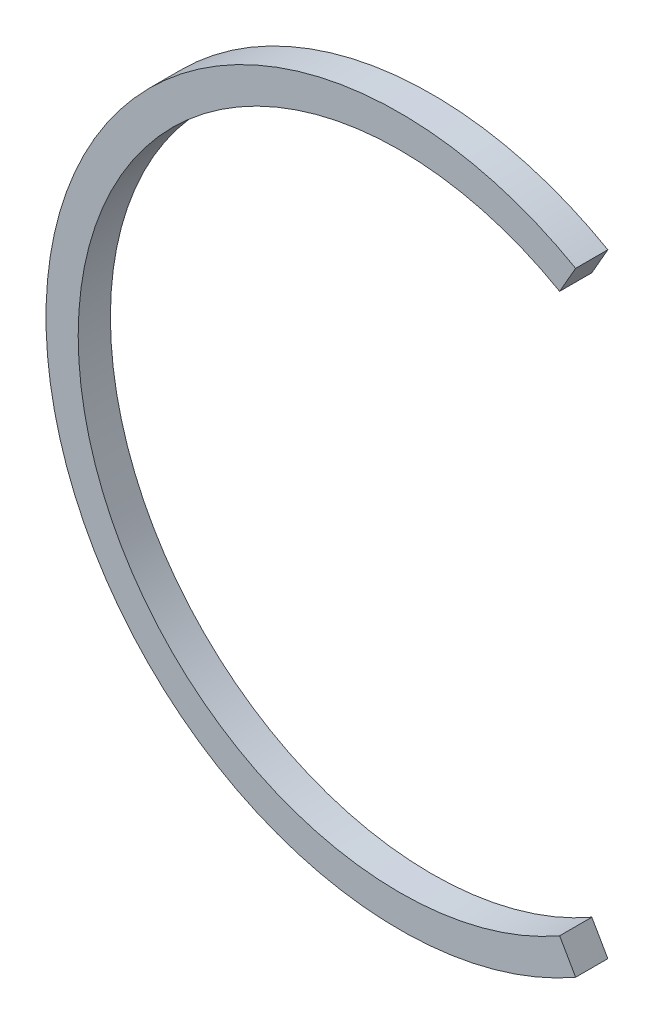
ISO-10303-21;
HEADER;
FILE_DESCRIPTION(('STEP AP214'),'2;1');
FILE_NAME('part.step','',(''),(''),'','','');
FILE_SCHEMA(('AUTOMOTIVE_DESIGN { 1 0 10303 214 1 1 1 1 }'));
ENDSEC;
DATA;
#1=APPLICATION_CONTEXT('core data for automotive mechanical design processes');
#2=APPLICATION_PROTOCOL_DEFINITION('international standard','automotive_design',2000,#1);
#3=PRODUCT_CONTEXT('',#1,'mechanical');
#4=PRODUCT('Part','Part','',(#3));
#5=PRODUCT_RELATED_PRODUCT_CATEGORY('part','',(#4));
#6=PRODUCT_DEFINITION_FORMATION('','',#4);
#7=PRODUCT_DEFINITION_CONTEXT('part definition',#1,'design');
#8=PRODUCT_DEFINITION('design','',#6,#7);
#9=PRODUCT_DEFINITION_SHAPE('','',#8);
#10=(LENGTH_UNIT() NAMED_UNIT(*) SI_UNIT(.MILLI.,.METRE.));
#11=(NAMED_UNIT(*) PLANE_ANGLE_UNIT() SI_UNIT($,.RADIAN.));
#12=(NAMED_UNIT(*) SI_UNIT($,.STERADIAN.) SOLID_ANGLE_UNIT());
#13=UNCERTAINTY_MEASURE_WITH_UNIT(LENGTH_MEASURE(1.E-05),#10,'distance_accuracy_value','');
#14=(GEOMETRIC_REPRESENTATION_CONTEXT(3) GLOBAL_UNCERTAINTY_ASSIGNED_CONTEXT((#13)) GLOBAL_UNIT_ASSIGNED_CONTEXT((#10,
#11,#12)) REPRESENTATION_CONTEXT('',''));
#15=CARTESIAN_POINT('',(0.,0.,0.));
#16=DIRECTION('',(0.,0.,1.));
#17=DIRECTION('',(1.,0.,0.));
#18=AXIS2_PLACEMENT_3D('',#15,#16,#17);
#19=CARTESIAN_POINT('',(0.,0.,-0.5334));
#20=DIRECTION('',(0.,0.,1.));
#21=DIRECTION('',(1.,0.,0.));
#22=AXIS2_PLACEMENT_3D('',#19,#20,#21);
#23=CYLINDRICAL_SURFACE('',#22,11.7221);
#24=DIRECTION('',(0.,0.,1.));
#25=VECTOR('',#24,1.);
#26=CARTESIAN_POINT('',(5.82692527614581,-10.1712619785459,-0.5334));
#27=LINE('',#26,#25);
#28=CARTESIAN_POINT('',(5.82692527614581,-10.1712619785459,-0.5334));
#29=VERTEX_POINT('',#28);
#30=CARTESIAN_POINT('',(5.82692527614581,-10.1712619785459,0.5334));
#31=VERTEX_POINT('',#30);
#32=EDGE_CURVE('E46',#29,#31,#27,.T.);
#33=ORIENTED_EDGE('',*,*,#32,.T.);
#34=CARTESIAN_POINT('',(0.,0.,0.5334));
#35=DIRECTION('',(0.,0.,1.));
#36=DIRECTION('',(1.,0.,0.));
#37=AXIS2_PLACEMENT_3D('',#34,#35,#36);
#38=CIRCLE('',#37,11.7221);
#39=CARTESIAN_POINT('',(5.82692527614581,10.1712619785459,0.5334));
#40=VERTEX_POINT('',#39);
#41=EDGE_CURVE('E84',#40,#31,#38,.T.);
#42=ORIENTED_EDGE('',*,*,#41,.F.);
#43=DIRECTION('',(0.,0.,1.));
#44=VECTOR('',#43,1.);
#45=CARTESIAN_POINT('',(5.82692527614581,10.1712619785459,-0.5334));
#46=LINE('',#45,#44);
#47=CARTESIAN_POINT('',(5.82692527614581,10.1712619785459,-0.5334));
#48=VERTEX_POINT('',#47);
#49=EDGE_CURVE('E11',#48,#40,#46,.T.);
#50=ORIENTED_EDGE('',*,*,#49,.F.);
#51=CARTESIAN_POINT('',(0.,0.,-0.5334));
#52=DIRECTION('',(0.,0.,1.));
#53=DIRECTION('',(1.,0.,0.));
#54=AXIS2_PLACEMENT_3D('',#51,#52,#53);
#55=CIRCLE('',#54,11.7221);
#56=EDGE_CURVE('E85',#48,#29,#55,.T.);
#57=ORIENTED_EDGE('',*,*,#56,.T.);
#58=EDGE_LOOP('',(#33,#42,#50,#57));
#59=FACE_BOUND('',#58,.T.);
#60=ADVANCED_FACE('F43',(#59),#23,.T.);
#61=CARTESIAN_POINT('',(5.29663088481726,9.2456,-0.5334));
#62=DIRECTION('',(0.867699642431465,-0.497088855763542,0.));
#63=DIRECTION('',(0.497088855763542,0.867699642431465,0.));
#64=AXIS2_PLACEMENT_3D('',#61,#62,#63);
#65=PLANE('',#64);
#66=ORIENTED_EDGE('',*,*,#49,.T.);
#67=DIRECTION('',(0.497088855763542,0.867699642431465,0.));
#68=VECTOR('',#67,1.);
#69=CARTESIAN_POINT('',(5.29663088481726,9.2456,0.5334));
#70=LINE('',#69,#68);
#71=CARTESIAN_POINT('',(5.29663088481726,9.2456,0.5334));
#72=VERTEX_POINT('',#71);
#73=EDGE_CURVE('E103',#72,#40,#70,.T.);
#74=ORIENTED_EDGE('',*,*,#73,.F.);
#75=DIRECTION('',(0.,0.,1.));
#76=VECTOR('',#75,1.);
#77=CARTESIAN_POINT('',(5.29663088481726,9.2456,-0.5334));
#78=LINE('',#77,#76);
#79=CARTESIAN_POINT('',(5.29663088481726,9.2456,-0.5334));
#80=VERTEX_POINT('',#79);
#81=EDGE_CURVE('E52',#80,#72,#78,.T.);
#82=ORIENTED_EDGE('',*,*,#81,.F.);
#83=DIRECTION('',(0.497088855763542,0.867699642431465,0.));
#84=VECTOR('',#83,1.);
#85=CARTESIAN_POINT('',(5.29663088481726,9.2456,-0.5334));
#86=LINE('',#85,#84);
#87=EDGE_CURVE('E91',#80,#48,#86,.T.);
#88=ORIENTED_EDGE('',*,*,#87,.T.);
#89=EDGE_LOOP('',(#66,#74,#82,#88));
#90=FACE_BOUND('',#89,.T.);
#91=ADVANCED_FACE('F139',(#90),#65,.T.);
#92=CARTESIAN_POINT('',(0.,0.,-0.5334));
#93=DIRECTION('',(0.,0.,1.));
#94=DIRECTION('',(1.,0.,0.));
#95=AXIS2_PLACEMENT_3D('',#92,#93,#94);
#96=CYLINDRICAL_SURFACE('',#95,10.6553);
#97=ORIENTED_EDGE('',*,*,#81,.T.);
#98=CARTESIAN_POINT('',(0.,0.,0.5334));
#99=DIRECTION('',(0.,0.,-1.));
#100=DIRECTION('',(1.,0.,0.));
#101=AXIS2_PLACEMENT_3D('',#98,#99,#100);
#102=CIRCLE('',#101,10.6553);
#103=CARTESIAN_POINT('',(5.29663088481726,-9.2456,0.5334));
#104=VERTEX_POINT('',#103);
#105=EDGE_CURVE('E99',#104,#72,#102,.T.);
#106=ORIENTED_EDGE('',*,*,#105,.F.);
#107=DIRECTION('',(0.,0.,1.));
#108=VECTOR('',#107,1.);
#109=CARTESIAN_POINT('',(5.29663088481726,-9.2456,-0.5334));
#110=LINE('',#109,#108);
#111=CARTESIAN_POINT('',(5.29663088481726,-9.2456,-0.5334));
#112=VERTEX_POINT('',#111);
#113=EDGE_CURVE('E90',#112,#104,#110,.T.);
#114=ORIENTED_EDGE('',*,*,#113,.F.);
#115=CARTESIAN_POINT('',(0.,0.,-0.5334));
#116=DIRECTION('',(0.,0.,-1.));
#117=DIRECTION('',(1.,0.,0.));
#118=AXIS2_PLACEMENT_3D('',#115,#116,#117);
#119=CIRCLE('',#118,10.6553);
#120=EDGE_CURVE('E117',#112,#80,#119,.T.);
#121=ORIENTED_EDGE('',*,*,#120,.T.);
#122=EDGE_LOOP('',(#97,#106,#114,#121));
#123=FACE_BOUND('',#122,.T.);
#124=ADVANCED_FACE('F136',(#123),#96,.F.);
#125=CARTESIAN_POINT('',(5.29663088481726,-9.2456,-0.5334));
#126=DIRECTION('',(0.867699642431464,0.497088855763544,0.));
#127=DIRECTION('',(-0.497088855763544,0.867699642431464,0.));
#128=AXIS2_PLACEMENT_3D('',#125,#126,#127);
#129=PLANE('',#128);
#130=ORIENTED_EDGE('',*,*,#113,.T.);
#131=DIRECTION('',(-0.497088855763544,0.867699642431464,0.));
#132=VECTOR('',#131,1.);
#133=CARTESIAN_POINT('',(5.29663088481726,-9.2456,0.5334));
#134=LINE('',#133,#132);
#135=EDGE_CURVE('E93',#31,#104,#134,.T.);
#136=ORIENTED_EDGE('',*,*,#135,.F.);
#137=ORIENTED_EDGE('',*,*,#32,.F.);
#138=DIRECTION('',(-0.497088855763544,0.867699642431464,0.));
#139=VECTOR('',#138,1.);
#140=CARTESIAN_POINT('',(5.29663088481726,-9.2456,-0.5334));
#141=LINE('',#140,#139);
#142=EDGE_CURVE('E114',#29,#112,#141,.T.);
#143=ORIENTED_EDGE('',*,*,#142,.T.);
#144=EDGE_LOOP('',(#130,#136,#137,#143));
#145=FACE_BOUND('',#144,.T.);
#146=ADVANCED_FACE('F94',(#145),#129,.T.);
#147=CARTESIAN_POINT('',(0.,0.,-0.5334));
#148=DIRECTION('',(0.,0.,1.));
#149=DIRECTION('',(1.,0.,0.));
#150=AXIS2_PLACEMENT_3D('',#147,#148,#149);
#151=PLANE('',#150);
#152=ORIENTED_EDGE('',*,*,#56,.F.);
#153=ORIENTED_EDGE('',*,*,#87,.F.);
#154=ORIENTED_EDGE('',*,*,#120,.F.);
#155=ORIENTED_EDGE('',*,*,#142,.F.);
#156=EDGE_LOOP('',(#152,#153,#154,#155));
#157=FACE_BOUND('',#156,.T.);
#158=ADVANCED_FACE('F141',(#157),#151,.F.);
#159=CARTESIAN_POINT('',(0.,0.,0.5334));
#160=DIRECTION('',(0.,0.,1.));
#161=DIRECTION('',(1.,0.,0.));
#162=AXIS2_PLACEMENT_3D('',#159,#160,#161);
#163=PLANE('',#162);
#164=ORIENTED_EDGE('',*,*,#41,.T.);
#165=ORIENTED_EDGE('',*,*,#135,.T.);
#166=ORIENTED_EDGE('',*,*,#105,.T.);
#167=ORIENTED_EDGE('',*,*,#73,.T.);
#168=EDGE_LOOP('',(#164,#165,#166,#167));
#169=FACE_BOUND('',#168,.T.);
#170=ADVANCED_FACE('F102',(#169),#163,.T.);
#171=CLOSED_SHELL('',(#60,#91,#124,#146,#158,#170));
#172=MANIFOLD_SOLID_BREP('B2',#171);
#173=ADVANCED_BREP_SHAPE_REPRESENTATION('',(#18,#172),#14);
#174=SHAPE_DEFINITION_REPRESENTATION(#9,#173);
ENDSEC;
END-ISO-10303-21;
